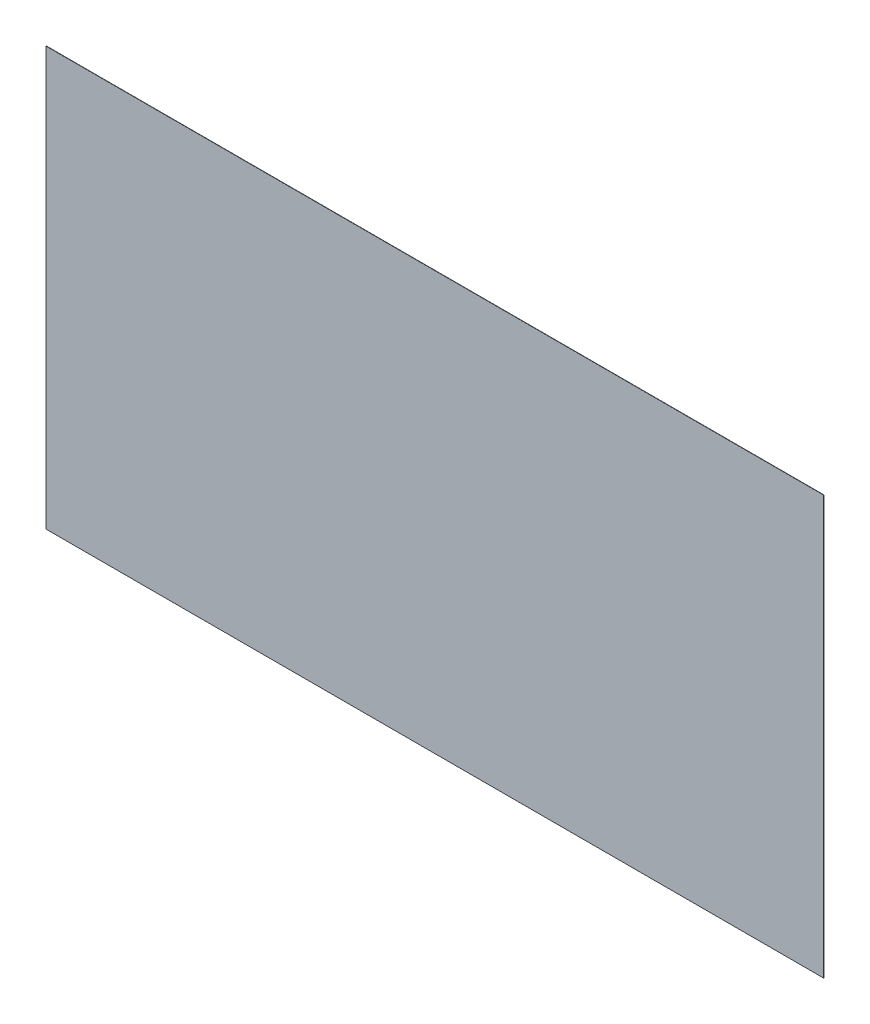
ISO-10303-21;
HEADER;
FILE_DESCRIPTION(('STEP AP214'),'2;1');
FILE_NAME('part.step','',(''),(''),'','','');
FILE_SCHEMA(('AUTOMOTIVE_DESIGN { 1 0 10303 214 1 1 1 1 }'));
ENDSEC;
DATA;
#1=APPLICATION_CONTEXT('core data for automotive mechanical design processes');
#2=APPLICATION_PROTOCOL_DEFINITION('international standard','automotive_design',2000,#1);
#3=PRODUCT_CONTEXT('',#1,'mechanical');
#4=PRODUCT('Part','Part','',(#3));
#5=PRODUCT_RELATED_PRODUCT_CATEGORY('part','',(#4));
#6=PRODUCT_DEFINITION_FORMATION('','',#4);
#7=PRODUCT_DEFINITION_CONTEXT('part definition',#1,'design');
#8=PRODUCT_DEFINITION('design','',#6,#7);
#9=PRODUCT_DEFINITION_SHAPE('','',#8);
#10=(LENGTH_UNIT() NAMED_UNIT(*) SI_UNIT(.MILLI.,.METRE.));
#11=(NAMED_UNIT(*) PLANE_ANGLE_UNIT() SI_UNIT($,.RADIAN.));
#12=(NAMED_UNIT(*) SI_UNIT($,.STERADIAN.) SOLID_ANGLE_UNIT());
#13=UNCERTAINTY_MEASURE_WITH_UNIT(LENGTH_MEASURE(1.E-05),#10,'distance_accuracy_value','');
#14=(GEOMETRIC_REPRESENTATION_CONTEXT(3) GLOBAL_UNCERTAINTY_ASSIGNED_CONTEXT((#13)) GLOBAL_UNIT_ASSIGNED_CONTEXT((#10,
#11,#12)) REPRESENTATION_CONTEXT('',''));
#15=CARTESIAN_POINT('',(0.,0.,0.));
#16=DIRECTION('',(0.,0.,1.));
#17=DIRECTION('',(1.,0.,0.));
#18=AXIS2_PLACEMENT_3D('',#15,#16,#17);
#19=CARTESIAN_POINT('',(-1050.,565.,0.9));
#20=DIRECTION('',(0.,-1.,0.));
#21=DIRECTION('',(0.,0.,-1.));
#22=AXIS2_PLACEMENT_3D('',#19,#20,#21);
#23=PLANE('',#22);
#24=DIRECTION('',(-1.,0.,0.));
#25=VECTOR('',#24,1.);
#26=CARTESIAN_POINT('',(-1050.,565.,0.));
#27=LINE('',#26,#25);
#28=CARTESIAN_POINT('',(1050.,565.,0.));
#29=VERTEX_POINT('',#28);
#30=CARTESIAN_POINT('',(-1050.,565.,0.));
#31=VERTEX_POINT('',#30);
#32=EDGE_CURVE('E182',#29,#31,#27,.T.);
#33=ORIENTED_EDGE('',*,*,#32,.T.);
#34=DIRECTION('',(0.,0.,-1.));
#35=VECTOR('',#34,1.);
#36=CARTESIAN_POINT('',(-1050.,565.,0.9));
#37=LINE('',#36,#35);
#38=CARTESIAN_POINT('',(-1050.,565.,0.9));
#39=VERTEX_POINT('',#38);
#40=EDGE_CURVE('E50',#39,#31,#37,.T.);
#41=ORIENTED_EDGE('',*,*,#40,.F.);
#42=DIRECTION('',(-1.,0.,0.));
#43=VECTOR('',#42,1.);
#44=CARTESIAN_POINT('',(-1050.,565.,0.9));
#45=LINE('',#44,#43);
#46=CARTESIAN_POINT('',(1050.,565.,0.9));
#47=VERTEX_POINT('',#46);
#48=EDGE_CURVE('E94',#47,#39,#45,.T.);
#49=ORIENTED_EDGE('',*,*,#48,.F.);
#50=DIRECTION('',(0.,0.,-1.));
#51=VECTOR('',#50,1.);
#52=CARTESIAN_POINT('',(1050.,565.,0.9));
#53=LINE('',#52,#51);
#54=EDGE_CURVE('E11',#47,#29,#53,.T.);
#55=ORIENTED_EDGE('',*,*,#54,.T.);
#56=EDGE_LOOP('',(#33,#41,#49,#55));
#57=FACE_BOUND('',#56,.T.);
#58=DIRECTION('',(-1.,0.,0.));
#59=VECTOR('',#58,1.);
#60=CARTESIAN_POINT('',(0.,565.,0.35));
#61=LINE('',#60,#59);
#62=CARTESIAN_POINT('',(1049.65,565.,0.35));
#63=VERTEX_POINT('',#62);
#64=CARTESIAN_POINT('',(-1049.65,565.,0.35));
#65=VERTEX_POINT('',#64);
#66=EDGE_CURVE('E141',#63,#65,#61,.T.);
#67=ORIENTED_EDGE('',*,*,#66,.F.);
#68=DIRECTION('',(0.,0.,-1.));
#69=VECTOR('',#68,1.);
#70=CARTESIAN_POINT('',(1049.65,565.,0.9));
#71=LINE('',#70,#69);
#72=CARTESIAN_POINT('',(1049.65,565.,0.55));
#73=VERTEX_POINT('',#72);
#74=EDGE_CURVE('E139',#73,#63,#71,.T.);
#75=ORIENTED_EDGE('',*,*,#74,.F.);
#76=DIRECTION('',(-1.,0.,0.));
#77=VECTOR('',#76,1.);
#78=CARTESIAN_POINT('',(0.,565.,0.55));
#79=LINE('',#78,#77);
#80=CARTESIAN_POINT('',(-1049.65,565.,0.55));
#81=VERTEX_POINT('',#80);
#82=EDGE_CURVE('E147',#73,#81,#79,.T.);
#83=ORIENTED_EDGE('',*,*,#82,.T.);
#84=DIRECTION('',(0.,0.,-1.));
#85=VECTOR('',#84,1.);
#86=CARTESIAN_POINT('',(-1049.65,565.,0.9));
#87=LINE('',#86,#85);
#88=EDGE_CURVE('E154',#81,#65,#87,.T.);
#89=ORIENTED_EDGE('',*,*,#88,.T.);
#90=EDGE_LOOP('',(#67,#75,#83,#89));
#91=FACE_BOUND('',#90,.T.);
#92=ADVANCED_FACE('F41',(#57,#91),#23,.F.);
#93=CARTESIAN_POINT('',(1050.,-565.,0.9));
#94=DIRECTION('',(-1.,0.,0.));
#95=DIRECTION('',(0.,0.,1.));
#96=AXIS2_PLACEMENT_3D('',#93,#94,#95);
#97=PLANE('',#96);
#98=DIRECTION('',(0.,1.,0.));
#99=VECTOR('',#98,1.);
#100=CARTESIAN_POINT('',(1050.,-565.,0.));
#101=LINE('',#100,#99);
#102=CARTESIAN_POINT('',(1050.,-565.,0.));
#103=VERTEX_POINT('',#102);
#104=EDGE_CURVE('E160',#103,#29,#101,.T.);
#105=ORIENTED_EDGE('',*,*,#104,.T.);
#106=ORIENTED_EDGE('',*,*,#54,.F.);
#107=DIRECTION('',(0.,1.,0.));
#108=VECTOR('',#107,1.);
#109=CARTESIAN_POINT('',(1050.,-565.,0.9));
#110=LINE('',#109,#108);
#111=CARTESIAN_POINT('',(1050.,-565.,0.9));
#112=VERTEX_POINT('',#111);
#113=EDGE_CURVE('E168',#112,#47,#110,.T.);
#114=ORIENTED_EDGE('',*,*,#113,.F.);
#115=DIRECTION('',(0.,0.,-1.));
#116=VECTOR('',#115,1.);
#117=CARTESIAN_POINT('',(1050.,-565.,0.9));
#118=LINE('',#117,#116);
#119=EDGE_CURVE('E178',#112,#103,#118,.T.);
#120=ORIENTED_EDGE('',*,*,#119,.T.);
#121=EDGE_LOOP('',(#105,#106,#114,#120));
#122=FACE_BOUND('',#121,.T.);
#123=ADVANCED_FACE('F43',(#122),#97,.F.);
#124=CARTESIAN_POINT('',(-1050.,-565.,0.9));
#125=DIRECTION('',(1.,0.,0.));
#126=DIRECTION('',(0.,0.,-1.));
#127=AXIS2_PLACEMENT_3D('',#124,#125,#126);
#128=PLANE('',#127);
#129=DIRECTION('',(0.,-1.,0.));
#130=VECTOR('',#129,1.);
#131=CARTESIAN_POINT('',(-1050.,-565.,0.));
#132=LINE('',#131,#130);
#133=CARTESIAN_POINT('',(-1050.,-565.,0.));
#134=VERTEX_POINT('',#133);
#135=EDGE_CURVE('E185',#31,#134,#132,.T.);
#136=ORIENTED_EDGE('',*,*,#135,.T.);
#137=DIRECTION('',(0.,0.,-1.));
#138=VECTOR('',#137,1.);
#139=CARTESIAN_POINT('',(-1050.,-565.,0.9));
#140=LINE('',#139,#138);
#141=CARTESIAN_POINT('',(-1050.,-565.,0.9));
#142=VERTEX_POINT('',#141);
#143=EDGE_CURVE('E192',#142,#134,#140,.T.);
#144=ORIENTED_EDGE('',*,*,#143,.F.);
#145=DIRECTION('',(0.,-1.,0.));
#146=VECTOR('',#145,1.);
#147=CARTESIAN_POINT('',(-1050.,-565.,0.9));
#148=LINE('',#147,#146);
#149=EDGE_CURVE('E173',#39,#142,#148,.T.);
#150=ORIENTED_EDGE('',*,*,#149,.F.);
#151=ORIENTED_EDGE('',*,*,#40,.T.);
#152=EDGE_LOOP('',(#136,#144,#150,#151));
#153=FACE_BOUND('',#152,.T.);
#154=ADVANCED_FACE('F199',(#153),#128,.F.);
#155=CARTESIAN_POINT('',(-1050.,-565.,0.9));
#156=DIRECTION('',(0.,1.,0.));
#157=DIRECTION('',(0.,0.,1.));
#158=AXIS2_PLACEMENT_3D('',#155,#156,#157);
#159=PLANE('',#158);
#160=DIRECTION('',(1.,0.,0.));
#161=VECTOR('',#160,1.);
#162=CARTESIAN_POINT('',(-1050.,-565.,0.));
#163=LINE('',#162,#161);
#164=EDGE_CURVE('E87',#134,#103,#163,.T.);
#165=ORIENTED_EDGE('',*,*,#164,.T.);
#166=ORIENTED_EDGE('',*,*,#119,.F.);
#167=DIRECTION('',(1.,0.,0.));
#168=VECTOR('',#167,1.);
#169=CARTESIAN_POINT('',(-1050.,-565.,0.9));
#170=LINE('',#169,#168);
#171=EDGE_CURVE('E66',#142,#112,#170,.T.);
#172=ORIENTED_EDGE('',*,*,#171,.F.);
#173=ORIENTED_EDGE('',*,*,#143,.T.);
#174=EDGE_LOOP('',(#165,#166,#172,#173));
#175=FACE_BOUND('',#174,.T.);
#176=ADVANCED_FACE('F207',(#175),#159,.F.);
#177=CARTESIAN_POINT('',(0.,0.,0.9));
#178=DIRECTION('',(0.,0.,-1.));
#179=DIRECTION('',(-1.,0.,0.));
#180=AXIS2_PLACEMENT_3D('',#177,#178,#179);
#181=PLANE('',#180);
#182=ORIENTED_EDGE('',*,*,#113,.T.);
#183=ORIENTED_EDGE('',*,*,#48,.T.);
#184=ORIENTED_EDGE('',*,*,#149,.T.);
#185=ORIENTED_EDGE('',*,*,#171,.T.);
#186=EDGE_LOOP('',(#182,#183,#184,#185));
#187=FACE_BOUND('',#186,.T.);
#188=ADVANCED_FACE('F209',(#187),#181,.F.);
#189=CARTESIAN_POINT('',(0.,0.,0.));
#190=DIRECTION('',(0.,0.,-1.));
#191=DIRECTION('',(-1.,0.,0.));
#192=AXIS2_PLACEMENT_3D('',#189,#190,#191);
#193=PLANE('',#192);
#194=ORIENTED_EDGE('',*,*,#104,.F.);
#195=ORIENTED_EDGE('',*,*,#164,.F.);
#196=ORIENTED_EDGE('',*,*,#135,.F.);
#197=ORIENTED_EDGE('',*,*,#32,.F.);
#198=EDGE_LOOP('',(#194,#195,#196,#197));
#199=FACE_BOUND('',#198,.T.);
#200=ADVANCED_FACE('F203',(#199),#193,.T.);
#201=CARTESIAN_POINT('',(1049.65,-565.,0.9));
#202=DIRECTION('',(-1.,0.,0.));
#203=DIRECTION('',(0.,0.,1.));
#204=AXIS2_PLACEMENT_3D('',#201,#202,#203);
#205=PLANE('',#204);
#206=DIRECTION('',(0.,1.,0.));
#207=VECTOR('',#206,1.);
#208=CARTESIAN_POINT('',(1049.65,0.,0.35));
#209=LINE('',#208,#207);
#210=CARTESIAN_POINT('',(1049.65,-564.65,0.35));
#211=VERTEX_POINT('',#210);
#212=EDGE_CURVE('E121',#211,#63,#209,.T.);
#213=ORIENTED_EDGE('',*,*,#212,.F.);
#214=DIRECTION('',(0.,0.,-1.));
#215=VECTOR('',#214,1.);
#216=CARTESIAN_POINT('',(1049.65,-564.65,0.9));
#217=LINE('',#216,#215);
#218=CARTESIAN_POINT('',(1049.65,-564.65,0.55));
#219=VERTEX_POINT('',#218);
#220=EDGE_CURVE('E130',#219,#211,#217,.T.);
#221=ORIENTED_EDGE('',*,*,#220,.F.);
#222=DIRECTION('',(0.,1.,0.));
#223=VECTOR('',#222,1.);
#224=CARTESIAN_POINT('',(1049.65,0.,0.55));
#225=LINE('',#224,#223);
#226=EDGE_CURVE('E57',#219,#73,#225,.T.);
#227=ORIENTED_EDGE('',*,*,#226,.T.);
#228=ORIENTED_EDGE('',*,*,#74,.T.);
#229=EDGE_LOOP('',(#213,#221,#227,#228));
#230=FACE_BOUND('',#229,.T.);
#231=ADVANCED_FACE('F137',(#230),#205,.T.);
#232=CARTESIAN_POINT('',(-1049.65,-565.,0.9));
#233=DIRECTION('',(1.,0.,0.));
#234=DIRECTION('',(0.,0.,-1.));
#235=AXIS2_PLACEMENT_3D('',#232,#233,#234);
#236=PLANE('',#235);
#237=DIRECTION('',(0.,-1.,0.));
#238=VECTOR('',#237,1.);
#239=CARTESIAN_POINT('',(-1049.65,0.,0.35));
#240=LINE('',#239,#238);
#241=CARTESIAN_POINT('',(-1049.65,-564.65,0.35));
#242=VERTEX_POINT('',#241);
#243=EDGE_CURVE('E124',#65,#242,#240,.T.);
#244=ORIENTED_EDGE('',*,*,#243,.F.);
#245=ORIENTED_EDGE('',*,*,#88,.F.);
#246=DIRECTION('',(0.,-1.,0.));
#247=VECTOR('',#246,1.);
#248=CARTESIAN_POINT('',(-1049.65,0.,0.55));
#249=LINE('',#248,#247);
#250=CARTESIAN_POINT('',(-1049.65,-564.65,0.55));
#251=VERTEX_POINT('',#250);
#252=EDGE_CURVE('E151',#81,#251,#249,.T.);
#253=ORIENTED_EDGE('',*,*,#252,.T.);
#254=DIRECTION('',(0.,0.,-1.));
#255=VECTOR('',#254,1.);
#256=CARTESIAN_POINT('',(-1049.65,-564.65,0.9));
#257=LINE('',#256,#255);
#258=EDGE_CURVE('E135',#251,#242,#257,.T.);
#259=ORIENTED_EDGE('',*,*,#258,.T.);
#260=EDGE_LOOP('',(#244,#245,#253,#259));
#261=FACE_BOUND('',#260,.T.);
#262=ADVANCED_FACE('F224',(#261),#236,.T.);
#263=CARTESIAN_POINT('',(-1050.,-564.65,0.9));
#264=DIRECTION('',(0.,1.,0.));
#265=DIRECTION('',(0.,0.,1.));
#266=AXIS2_PLACEMENT_3D('',#263,#264,#265);
#267=PLANE('',#266);
#268=DIRECTION('',(1.,0.,0.));
#269=VECTOR('',#268,1.);
#270=CARTESIAN_POINT('',(0.,-564.65,0.35));
#271=LINE('',#270,#269);
#272=EDGE_CURVE('E117',#242,#211,#271,.T.);
#273=ORIENTED_EDGE('',*,*,#272,.F.);
#274=ORIENTED_EDGE('',*,*,#258,.F.);
#275=DIRECTION('',(1.,0.,0.));
#276=VECTOR('',#275,1.);
#277=CARTESIAN_POINT('',(0.,-564.65,0.55));
#278=LINE('',#277,#276);
#279=EDGE_CURVE('E133',#251,#219,#278,.T.);
#280=ORIENTED_EDGE('',*,*,#279,.T.);
#281=ORIENTED_EDGE('',*,*,#220,.T.);
#282=EDGE_LOOP('',(#273,#274,#280,#281));
#283=FACE_BOUND('',#282,.T.);
#284=ADVANCED_FACE('F131',(#283),#267,.T.);
#285=CARTESIAN_POINT('',(0.,0.,0.55));
#286=DIRECTION('',(0.,0.,-1.));
#287=DIRECTION('',(-1.,0.,0.));
#288=AXIS2_PLACEMENT_3D('',#285,#286,#287);
#289=PLANE('',#288);
#290=ORIENTED_EDGE('',*,*,#226,.F.);
#291=ORIENTED_EDGE('',*,*,#279,.F.);
#292=ORIENTED_EDGE('',*,*,#252,.F.);
#293=ORIENTED_EDGE('',*,*,#82,.F.);
#294=EDGE_LOOP('',(#290,#291,#292,#293));
#295=FACE_BOUND('',#294,.T.);
#296=ADVANCED_FACE('F227',(#295),#289,.T.);
#297=CARTESIAN_POINT('',(0.,0.,0.35));
#298=DIRECTION('',(0.,0.,-1.));
#299=DIRECTION('',(-1.,0.,0.));
#300=AXIS2_PLACEMENT_3D('',#297,#298,#299);
#301=PLANE('',#300);
#302=ORIENTED_EDGE('',*,*,#212,.T.);
#303=ORIENTED_EDGE('',*,*,#66,.T.);
#304=ORIENTED_EDGE('',*,*,#243,.T.);
#305=ORIENTED_EDGE('',*,*,#272,.T.);
#306=EDGE_LOOP('',(#302,#303,#304,#305));
#307=FACE_BOUND('',#306,.T.);
#308=ADVANCED_FACE('F119',(#307),#301,.F.);
#309=CLOSED_SHELL('',(#92,#123,#154,#176,#188,#200,#231,#262,#284,#296,#308));
#310=MANIFOLD_SOLID_BREP('B2',#309);
#311=ADVANCED_BREP_SHAPE_REPRESENTATION('',(#18,#310),#14);
#312=SHAPE_DEFINITION_REPRESENTATION(#9,#311);
ENDSEC;
END-ISO-10303-21;
